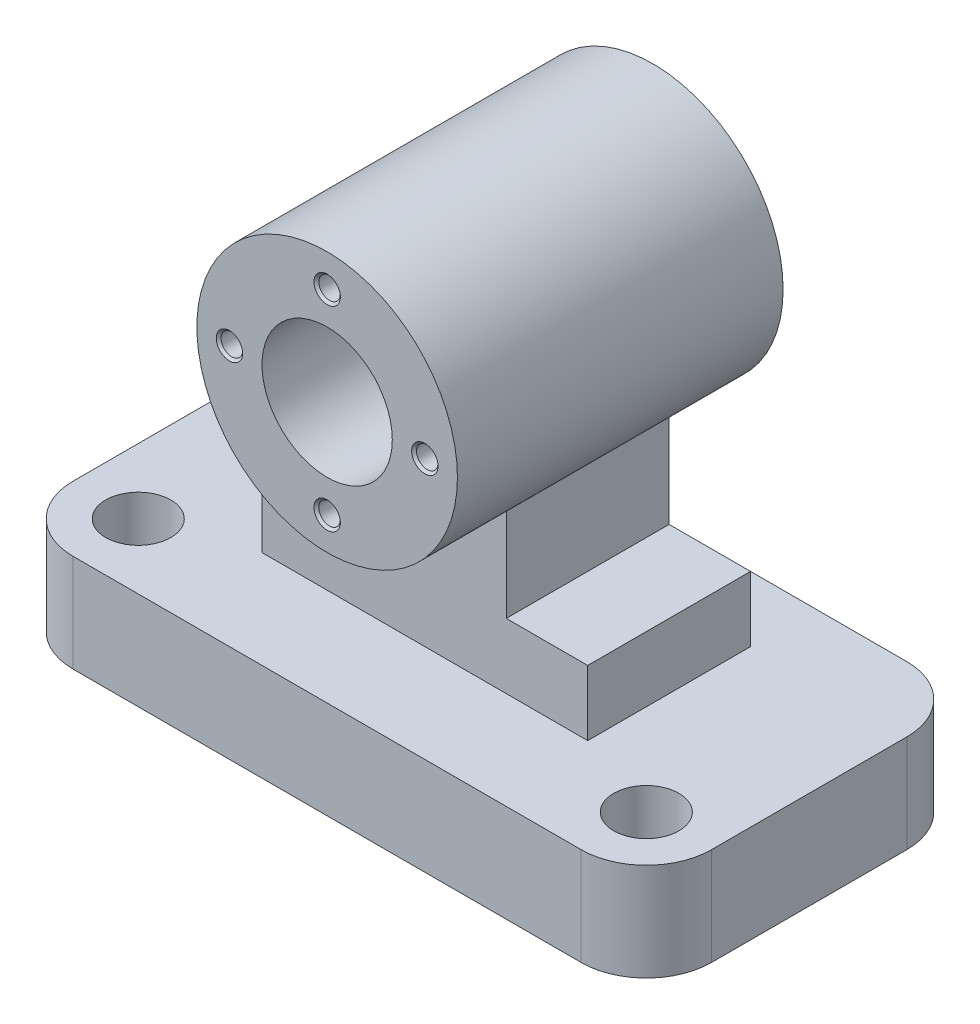
ISO-10303-21;
HEADER;
FILE_DESCRIPTION(('STEP AP214'),'2;1');
FILE_NAME('part.step','',(''),(''),'','','');
FILE_SCHEMA(('AUTOMOTIVE_DESIGN { 1 0 10303 214 1 1 1 1 }'));
ENDSEC;
DATA;
#1=APPLICATION_CONTEXT('core data for automotive mechanical design processes');
#2=APPLICATION_PROTOCOL_DEFINITION('international standard','automotive_design',2000,#1);
#3=PRODUCT_CONTEXT('',#1,'mechanical');
#4=PRODUCT('Part','Part','',(#3));
#5=PRODUCT_RELATED_PRODUCT_CATEGORY('part','',(#4));
#6=PRODUCT_DEFINITION_FORMATION('','',#4);
#7=PRODUCT_DEFINITION_CONTEXT('part definition',#1,'design');
#8=PRODUCT_DEFINITION('design','',#6,#7);
#9=PRODUCT_DEFINITION_SHAPE('','',#8);
#10=(LENGTH_UNIT() NAMED_UNIT(*) SI_UNIT(.MILLI.,.METRE.));
#11=(NAMED_UNIT(*) PLANE_ANGLE_UNIT() SI_UNIT($,.RADIAN.));
#12=(NAMED_UNIT(*) SI_UNIT($,.STERADIAN.) SOLID_ANGLE_UNIT());
#13=UNCERTAINTY_MEASURE_WITH_UNIT(LENGTH_MEASURE(1.E-05),#10,'distance_accuracy_value','');
#14=(GEOMETRIC_REPRESENTATION_CONTEXT(3) GLOBAL_UNCERTAINTY_ASSIGNED_CONTEXT((#13)) GLOBAL_UNIT_ASSIGNED_CONTEXT((#10,
#11,#12)) REPRESENTATION_CONTEXT('',''));
#15=CARTESIAN_POINT('',(0.,0.,0.));
#16=DIRECTION('',(0.,0.,1.));
#17=DIRECTION('',(1.,0.,0.));
#18=AXIS2_PLACEMENT_3D('',#15,#16,#17);
#19=CARTESIAN_POINT('',(-49.,-20.0073969276246,50.));
#20=DIRECTION('',(0.,-1.,0.));
#21=DIRECTION('',(0.,0.,-1.));
#22=AXIS2_PLACEMENT_3D('',#19,#20,#21);
#23=PLANE('',#22);
#24=CARTESIAN_POINT('',(-39.,-20.0073969276246,40.));
#25=DIRECTION('',(0.,1.,0.));
#26=DIRECTION('',(0.,0.,1.));
#27=AXIS2_PLACEMENT_3D('',#24,#25,#26);
#28=CIRCLE('',#27,5.);
#29=CARTESIAN_POINT('',(-39.,-20.0073969276246,45.));
#30=VERTEX_POINT('',#29);
#31=EDGE_CURVE('E246',#30,#30,#28,.T.);
#32=ORIENTED_EDGE('',*,*,#31,.F.);
#33=EDGE_LOOP('',(#32));
#34=FACE_BOUND('',#33,.T.);
#35=CARTESIAN_POINT('',(39.,-20.0073969276246,40.));
#36=DIRECTION('',(0.,1.,0.));
#37=DIRECTION('',(0.,0.,1.));
#38=AXIS2_PLACEMENT_3D('',#35,#36,#37);
#39=CIRCLE('',#38,5.);
#40=CARTESIAN_POINT('',(39.,-20.0073969276246,45.));
#41=VERTEX_POINT('',#40);
#42=EDGE_CURVE('E245',#41,#41,#39,.T.);
#43=ORIENTED_EDGE('',*,*,#42,.F.);
#44=EDGE_LOOP('',(#43));
#45=FACE_BOUND('',#44,.T.);
#46=DIRECTION('',(-1.,0.,0.));
#47=VECTOR('',#46,1.);
#48=CARTESIAN_POINT('',(-49.,-20.0073969276246,0.));
#49=LINE('',#48,#47);
#50=CARTESIAN_POINT('',(39.,-20.0073969276246,0.));
#51=VERTEX_POINT('',#50);
#52=CARTESIAN_POINT('',(-39.,-20.0073969276246,0.));
#53=VERTEX_POINT('',#52);
#54=EDGE_CURVE('E287',#51,#53,#49,.T.);
#55=ORIENTED_EDGE('',*,*,#54,.T.);
#56=CARTESIAN_POINT('',(-39.,-20.0073969276246,10.));
#57=DIRECTION('',(0.,-1.,0.));
#58=DIRECTION('',(0.,0.,-1.));
#59=AXIS2_PLACEMENT_3D('',#56,#57,#58);
#60=CIRCLE('',#59,10.);
#61=CARTESIAN_POINT('',(-49.,-20.0073969276246,10.));
#62=VERTEX_POINT('',#61);
#63=EDGE_CURVE('E348',#53,#62,#60,.F.);
#64=ORIENTED_EDGE('',*,*,#63,.T.);
#65=DIRECTION('',(0.,0.,-1.));
#66=VECTOR('',#65,1.);
#67=CARTESIAN_POINT('',(-49.,-20.0073969276246,50.));
#68=LINE('',#67,#66);
#69=CARTESIAN_POINT('',(-49.,-20.0073969276246,40.));
#70=VERTEX_POINT('',#69);
#71=EDGE_CURVE('E313',#70,#62,#68,.T.);
#72=ORIENTED_EDGE('',*,*,#71,.F.);
#73=CARTESIAN_POINT('',(-39.,-20.0073969276246,40.));
#74=DIRECTION('',(0.,-1.,0.));
#75=DIRECTION('',(0.,0.,-1.));
#76=AXIS2_PLACEMENT_3D('',#73,#74,#75);
#77=CIRCLE('',#76,10.);
#78=CARTESIAN_POINT('',(-39.,-20.0073969276246,50.));
#79=VERTEX_POINT('',#78);
#80=EDGE_CURVE('E342',#70,#79,#77,.F.);
#81=ORIENTED_EDGE('',*,*,#80,.T.);
#82=DIRECTION('',(-1.,0.,0.));
#83=VECTOR('',#82,1.);
#84=CARTESIAN_POINT('',(-49.,-20.0073969276246,50.));
#85=LINE('',#84,#83);
#86=CARTESIAN_POINT('',(39.,-20.0073969276246,50.));
#87=VERTEX_POINT('',#86);
#88=EDGE_CURVE('E296',#87,#79,#85,.T.);
#89=ORIENTED_EDGE('',*,*,#88,.F.);
#90=CARTESIAN_POINT('',(39.,-20.0073969276246,40.));
#91=DIRECTION('',(0.,-1.,0.));
#92=DIRECTION('',(0.,0.,-1.));
#93=AXIS2_PLACEMENT_3D('',#90,#91,#92);
#94=CIRCLE('',#93,10.);
#95=CARTESIAN_POINT('',(49.,-20.0073969276246,40.));
#96=VERTEX_POINT('',#95);
#97=EDGE_CURVE('E344',#87,#96,#94,.F.);
#98=ORIENTED_EDGE('',*,*,#97,.T.);
#99=DIRECTION('',(0.,0.,-1.));
#100=VECTOR('',#99,1.);
#101=CARTESIAN_POINT('',(49.,-20.0073969276246,50.));
#102=LINE('',#101,#100);
#103=CARTESIAN_POINT('',(49.,-20.0073969276246,10.));
#104=VERTEX_POINT('',#103);
#105=EDGE_CURVE('E316',#96,#104,#102,.T.);
#106=ORIENTED_EDGE('',*,*,#105,.T.);
#107=CARTESIAN_POINT('',(39.,-20.0073969276246,10.));
#108=DIRECTION('',(0.,-1.,0.));
#109=DIRECTION('',(0.,0.,-1.));
#110=AXIS2_PLACEMENT_3D('',#107,#108,#109);
#111=CIRCLE('',#110,10.);
#112=EDGE_CURVE('E346',#104,#51,#111,.F.);
#113=ORIENTED_EDGE('',*,*,#112,.T.);
#114=EDGE_LOOP('',(#55,#64,#72,#81,#89,#98,#106,#113));
#115=FACE_BOUND('',#114,.T.);
#116=DIRECTION('',(1.,0.,0.));
#117=VECTOR('',#116,1.);
#118=CARTESIAN_POINT('',(-12.5,-20.0073969276246,10.));
#119=LINE('',#118,#117);
#120=CARTESIAN_POINT('',(-25.,-20.0073969276246,9.99999999999999));
#121=VERTEX_POINT('',#120);
#122=CARTESIAN_POINT('',(25.,-20.0073969276246,9.99999999999999));
#123=VERTEX_POINT('',#122);
#124=EDGE_CURVE('E56',#121,#123,#119,.T.);
#125=ORIENTED_EDGE('',*,*,#124,.T.);
#126=DIRECTION('',(0.,0.,1.));
#127=VECTOR('',#126,1.);
#128=CARTESIAN_POINT('',(25.,-20.0073969276246,9.99999999999999));
#129=LINE('',#128,#127);
#130=CARTESIAN_POINT('',(25.,-20.0073969276246,35.));
#131=VERTEX_POINT('',#130);
#132=EDGE_CURVE('E189',#123,#131,#129,.T.);
#133=ORIENTED_EDGE('',*,*,#132,.T.);
#134=DIRECTION('',(1.,0.,0.));
#135=VECTOR('',#134,1.);
#136=CARTESIAN_POINT('',(-12.5,-20.0073969276246,35.));
#137=LINE('',#136,#135);
#138=CARTESIAN_POINT('',(-25.,-20.0073969276246,35.));
#139=VERTEX_POINT('',#138);
#140=EDGE_CURVE('E64',#139,#131,#137,.T.);
#141=ORIENTED_EDGE('',*,*,#140,.F.);
#142=DIRECTION('',(0.,0.,1.));
#143=VECTOR('',#142,1.);
#144=CARTESIAN_POINT('',(-25.,-20.0073969276246,9.99999999999999));
#145=LINE('',#144,#143);
#146=EDGE_CURVE('E202',#121,#139,#145,.T.);
#147=ORIENTED_EDGE('',*,*,#146,.F.);
#148=EDGE_LOOP('',(#125,#133,#141,#147));
#149=FACE_BOUND('',#148,.T.);
#150=ADVANCED_FACE('F41',(#34,#45,#115,#149),#23,.F.);
#151=CARTESIAN_POINT('',(-12.5,4.33819887216126,35.));
#152=DIRECTION('',(0.,1.,0.));
#153=DIRECTION('',(0.,0.,1.));
#154=AXIS2_PLACEMENT_3D('',#151,#152,#153);
#155=PLANE('',#154);
#156=DIRECTION('',(0.,0.,1.));
#157=VECTOR('',#156,1.);
#158=CARTESIAN_POINT('',(-12.4474748096278,4.33819887216126,0.));
#159=LINE('',#158,#157);
#160=CARTESIAN_POINT('',(-12.4474748096278,4.33819887216126,10.));
#161=VERTEX_POINT('',#160);
#162=CARTESIAN_POINT('',(-12.4474748096278,4.33819887216126,35.));
#163=VERTEX_POINT('',#162);
#164=EDGE_CURVE('E322',#161,#163,#159,.T.);
#165=ORIENTED_EDGE('',*,*,#164,.F.);
#166=DIRECTION('',(1.,0.,0.));
#167=VECTOR('',#166,1.);
#168=CARTESIAN_POINT('',(-12.5,4.33819887216126,10.));
#169=LINE('',#168,#167);
#170=CARTESIAN_POINT('',(-12.5,4.33819887216126,10.));
#171=VERTEX_POINT('',#170);
#172=EDGE_CURVE('E293',#171,#161,#169,.T.);
#173=ORIENTED_EDGE('',*,*,#172,.F.);
#174=DIRECTION('',(0.,0.,1.));
#175=VECTOR('',#174,1.);
#176=CARTESIAN_POINT('',(-12.5,4.33819887216126,35.));
#177=LINE('',#176,#175);
#178=CARTESIAN_POINT('',(-12.5,4.33819887216126,35.));
#179=VERTEX_POINT('',#178);
#180=EDGE_CURVE('E273',#171,#179,#177,.T.);
#181=ORIENTED_EDGE('',*,*,#180,.T.);
#182=DIRECTION('',(1.,0.,0.));
#183=VECTOR('',#182,1.);
#184=CARTESIAN_POINT('',(-12.5,4.33819887216126,35.));
#185=LINE('',#184,#183);
#186=EDGE_CURVE('E289',#179,#163,#185,.T.);
#187=ORIENTED_EDGE('',*,*,#186,.T.);
#188=EDGE_LOOP('',(#165,#173,#181,#187));
#189=FACE_BOUND('',#188,.T.);
#190=ADVANCED_FACE('F383',(#189),#155,.T.);
#191=CARTESIAN_POINT('',(49.,-20.0073969276246,50.));
#192=DIRECTION('',(-1.,0.,0.));
#193=DIRECTION('',(0.,-1.,0.));
#194=AXIS2_PLACEMENT_3D('',#191,#192,#193);
#195=PLANE('',#194);
#196=DIRECTION('',(0.,0.,-1.));
#197=VECTOR('',#196,1.);
#198=CARTESIAN_POINT('',(49.,-35.0073969276246,50.));
#199=LINE('',#198,#197);
#200=CARTESIAN_POINT('',(49.,-35.0073969276246,40.));
#201=VERTEX_POINT('',#200);
#202=CARTESIAN_POINT('',(49.,-35.0073969276246,10.));
#203=VERTEX_POINT('',#202);
#204=EDGE_CURVE('E303',#201,#203,#199,.T.);
#205=ORIENTED_EDGE('',*,*,#204,.T.);
#206=DIRECTION('',(0.,1.,0.));
#207=VECTOR('',#206,1.);
#208=CARTESIAN_POINT('',(49.,-20.0073969276246,10.));
#209=LINE('',#208,#207);
#210=EDGE_CURVE('E352',#203,#104,#209,.T.);
#211=ORIENTED_EDGE('',*,*,#210,.T.);
#212=ORIENTED_EDGE('',*,*,#105,.F.);
#213=DIRECTION('',(0.,1.,0.));
#214=VECTOR('',#213,1.);
#215=CARTESIAN_POINT('',(49.,-35.0073969276246,40.));
#216=LINE('',#215,#214);
#217=EDGE_CURVE('E350',#96,#201,#216,.F.);
#218=ORIENTED_EDGE('',*,*,#217,.T.);
#219=EDGE_LOOP('',(#205,#211,#212,#218));
#220=FACE_BOUND('',#219,.T.);
#221=ADVANCED_FACE('F389',(#220),#195,.F.);
#222=CARTESIAN_POINT('',(-49.,-20.0073969276246,50.));
#223=DIRECTION('',(1.,0.,0.));
#224=DIRECTION('',(0.,0.,-1.));
#225=AXIS2_PLACEMENT_3D('',#222,#223,#224);
#226=PLANE('',#225);
#227=ORIENTED_EDGE('',*,*,#71,.T.);
#228=DIRECTION('',(0.,-1.,0.));
#229=VECTOR('',#228,1.);
#230=CARTESIAN_POINT('',(-49.,-20.0073969276246,10.));
#231=LINE('',#230,#229);
#232=CARTESIAN_POINT('',(-49.,-35.0073969276246,10.));
#233=VERTEX_POINT('',#232);
#234=EDGE_CURVE('E327',#62,#233,#231,.T.);
#235=ORIENTED_EDGE('',*,*,#234,.T.);
#236=DIRECTION('',(0.,0.,-1.));
#237=VECTOR('',#236,1.);
#238=CARTESIAN_POINT('',(-49.,-35.0073969276246,50.));
#239=LINE('',#238,#237);
#240=CARTESIAN_POINT('',(-49.,-35.0073969276246,40.));
#241=VERTEX_POINT('',#240);
#242=EDGE_CURVE('E310',#241,#233,#239,.T.);
#243=ORIENTED_EDGE('',*,*,#242,.F.);
#244=DIRECTION('',(0.,-1.,0.));
#245=VECTOR('',#244,1.);
#246=CARTESIAN_POINT('',(-49.,-20.0073969276246,40.));
#247=LINE('',#246,#245);
#248=EDGE_CURVE('E325',#241,#70,#247,.F.);
#249=ORIENTED_EDGE('',*,*,#248,.T.);
#250=EDGE_LOOP('',(#227,#235,#243,#249));
#251=FACE_BOUND('',#250,.T.);
#252=ADVANCED_FACE('F397',(#251),#226,.F.);
#253=CARTESIAN_POINT('',(-49.,-35.0073969276246,50.));
#254=DIRECTION('',(0.,1.,0.));
#255=DIRECTION('',(0.,0.,1.));
#256=AXIS2_PLACEMENT_3D('',#253,#254,#255);
#257=PLANE('',#256);
#258=CARTESIAN_POINT('',(-39.,-35.0073969276246,40.));
#259=DIRECTION('',(0.,1.,0.));
#260=DIRECTION('',(0.,0.,1.));
#261=AXIS2_PLACEMENT_3D('',#258,#259,#260);
#262=CIRCLE('',#261,5.);
#263=CARTESIAN_POINT('',(-39.,-35.0073969276246,45.));
#264=VERTEX_POINT('',#263);
#265=EDGE_CURVE('E259',#264,#264,#262,.T.);
#266=ORIENTED_EDGE('',*,*,#265,.T.);
#267=EDGE_LOOP('',(#266));
#268=FACE_BOUND('',#267,.T.);
#269=CARTESIAN_POINT('',(39.,-35.0073969276246,40.));
#270=DIRECTION('',(0.,1.,0.));
#271=DIRECTION('',(0.,0.,1.));
#272=AXIS2_PLACEMENT_3D('',#269,#270,#271);
#273=CIRCLE('',#272,5.);
#274=CARTESIAN_POINT('',(39.,-35.0073969276246,45.));
#275=VERTEX_POINT('',#274);
#276=EDGE_CURVE('E249',#275,#275,#273,.T.);
#277=ORIENTED_EDGE('',*,*,#276,.T.);
#278=EDGE_LOOP('',(#277));
#279=FACE_BOUND('',#278,.T.);
#280=ORIENTED_EDGE('',*,*,#242,.T.);
#281=CARTESIAN_POINT('',(-39.,-35.0073969276246,10.));
#282=DIRECTION('',(0.,1.,0.));
#283=DIRECTION('',(0.,0.,1.));
#284=AXIS2_PLACEMENT_3D('',#281,#282,#283);
#285=CIRCLE('',#284,10.);
#286=CARTESIAN_POINT('',(-39.,-35.0073969276246,0.));
#287=VERTEX_POINT('',#286);
#288=EDGE_CURVE('E336',#233,#287,#285,.F.);
#289=ORIENTED_EDGE('',*,*,#288,.T.);
#290=DIRECTION('',(1.,0.,0.));
#291=VECTOR('',#290,1.);
#292=CARTESIAN_POINT('',(-49.,-35.0073969276246,0.));
#293=LINE('',#292,#291);
#294=CARTESIAN_POINT('',(39.,-35.0073969276246,0.));
#295=VERTEX_POINT('',#294);
#296=EDGE_CURVE('E300',#287,#295,#293,.T.);
#297=ORIENTED_EDGE('',*,*,#296,.T.);
#298=CARTESIAN_POINT('',(39.,-35.0073969276246,10.));
#299=DIRECTION('',(0.,1.,0.));
#300=DIRECTION('',(0.,0.,1.));
#301=AXIS2_PLACEMENT_3D('',#298,#299,#300);
#302=CIRCLE('',#301,10.);
#303=EDGE_CURVE('E334',#295,#203,#302,.F.);
#304=ORIENTED_EDGE('',*,*,#303,.T.);
#305=ORIENTED_EDGE('',*,*,#204,.F.);
#306=CARTESIAN_POINT('',(39.,-35.0073969276246,40.));
#307=DIRECTION('',(0.,1.,0.));
#308=DIRECTION('',(0.,0.,1.));
#309=AXIS2_PLACEMENT_3D('',#306,#307,#308);
#310=CIRCLE('',#309,10.);
#311=CARTESIAN_POINT('',(39.,-35.0073969276246,50.));
#312=VERTEX_POINT('',#311);
#313=EDGE_CURVE('E332',#201,#312,#310,.F.);
#314=ORIENTED_EDGE('',*,*,#313,.T.);
#315=DIRECTION('',(1.,0.,0.));
#316=VECTOR('',#315,1.);
#317=CARTESIAN_POINT('',(-49.,-35.0073969276246,50.));
#318=LINE('',#317,#316);
#319=CARTESIAN_POINT('',(-39.,-35.0073969276246,50.));
#320=VERTEX_POINT('',#319);
#321=EDGE_CURVE('E299',#320,#312,#318,.T.);
#322=ORIENTED_EDGE('',*,*,#321,.F.);
#323=CARTESIAN_POINT('',(-39.,-35.0073969276246,40.));
#324=DIRECTION('',(0.,1.,0.));
#325=DIRECTION('',(0.,0.,1.));
#326=AXIS2_PLACEMENT_3D('',#323,#324,#325);
#327=CIRCLE('',#326,10.);
#328=EDGE_CURVE('E330',#320,#241,#327,.F.);
#329=ORIENTED_EDGE('',*,*,#328,.T.);
#330=EDGE_LOOP('',(#280,#289,#297,#304,#305,#314,#322,#329));
#331=FACE_BOUND('',#330,.T.);
#332=ADVANCED_FACE('F364',(#268,#279,#331),#257,.F.);
#333=CARTESIAN_POINT('',(0.,0.,50.));
#334=DIRECTION('',(0.,0.,1.));
#335=DIRECTION('',(1.,0.,0.));
#336=AXIS2_PLACEMENT_3D('',#333,#334,#335);
#337=PLANE('',#336);
#338=ORIENTED_EDGE('',*,*,#321,.T.);
#339=DIRECTION('',(0.,1.,0.));
#340=VECTOR('',#339,1.);
#341=CARTESIAN_POINT('',(39.,-20.0073969276246,50.));
#342=LINE('',#341,#340);
#343=EDGE_CURVE('E49',#312,#87,#342,.T.);
#344=ORIENTED_EDGE('',*,*,#343,.T.);
#345=ORIENTED_EDGE('',*,*,#88,.T.);
#346=DIRECTION('',(0.,-1.,0.));
#347=VECTOR('',#346,1.);
#348=CARTESIAN_POINT('',(-39.,-35.0073969276246,50.));
#349=LINE('',#348,#347);
#350=EDGE_CURVE('E355',#79,#320,#349,.T.);
#351=ORIENTED_EDGE('',*,*,#350,.T.);
#352=EDGE_LOOP('',(#338,#344,#345,#351));
#353=FACE_BOUND('',#352,.T.);
#354=ADVANCED_FACE('F424',(#353),#337,.T.);
#355=CARTESIAN_POINT('',(0.,0.,0.));
#356=DIRECTION('',(0.,0.,1.));
#357=DIRECTION('',(1.,0.,0.));
#358=AXIS2_PLACEMENT_3D('',#355,#356,#357);
#359=PLANE('',#358);
#360=ORIENTED_EDGE('',*,*,#296,.F.);
#361=DIRECTION('',(0.,-1.,0.));
#362=VECTOR('',#361,1.);
#363=CARTESIAN_POINT('',(-39.,0.,0.));
#364=LINE('',#363,#362);
#365=EDGE_CURVE('E340',#287,#53,#364,.F.);
#366=ORIENTED_EDGE('',*,*,#365,.T.);
#367=ORIENTED_EDGE('',*,*,#54,.F.);
#368=DIRECTION('',(0.,1.,0.));
#369=VECTOR('',#368,1.);
#370=CARTESIAN_POINT('',(39.,0.,0.));
#371=LINE('',#370,#369);
#372=EDGE_CURVE('E338',#51,#295,#371,.F.);
#373=ORIENTED_EDGE('',*,*,#372,.T.);
#374=EDGE_LOOP('',(#360,#366,#367,#373));
#375=FACE_BOUND('',#374,.T.);
#376=ADVANCED_FACE('F438',(#375),#359,.F.);
#377=CARTESIAN_POINT('',(-12.5,4.33819887216126,10.));
#378=DIRECTION('',(0.,0.,-1.));
#379=DIRECTION('',(0.,1.,0.));
#380=AXIS2_PLACEMENT_3D('',#377,#378,#379);
#381=PLANE('',#380);
#382=DIRECTION('',(0.,1.,0.));
#383=VECTOR('',#382,1.);
#384=CARTESIAN_POINT('',(12.5,4.33819887216126,10.));
#385=LINE('',#384,#383);
#386=CARTESIAN_POINT('',(12.5,-10.0073969276246,10.));
#387=VERTEX_POINT('',#386);
#388=CARTESIAN_POINT('',(12.5,4.33819887216126,10.));
#389=VERTEX_POINT('',#388);
#390=EDGE_CURVE('E185',#387,#389,#385,.T.);
#391=ORIENTED_EDGE('',*,*,#390,.F.);
#392=DIRECTION('',(-1.,0.,0.));
#393=VECTOR('',#392,1.);
#394=CARTESIAN_POINT('',(-25.,-10.0073969276246,9.99999999999999));
#395=LINE('',#394,#393);
#396=CARTESIAN_POINT('',(25.,-10.0073969276246,9.99999999999999));
#397=VERTEX_POINT('',#396);
#398=EDGE_CURVE('E170',#397,#387,#395,.T.);
#399=ORIENTED_EDGE('',*,*,#398,.F.);
#400=DIRECTION('',(0.,1.,0.));
#401=VECTOR('',#400,1.);
#402=CARTESIAN_POINT('',(25.,-10.0073969276246,9.99999999999999));
#403=LINE('',#402,#401);
#404=EDGE_CURVE('E183',#123,#397,#403,.T.);
#405=ORIENTED_EDGE('',*,*,#404,.F.);
#406=ORIENTED_EDGE('',*,*,#124,.F.);
#407=DIRECTION('',(0.,-1.,0.));
#408=VECTOR('',#407,1.);
#409=CARTESIAN_POINT('',(-25.,-10.0073969276246,9.99999999999999));
#410=LINE('',#409,#408);
#411=CARTESIAN_POINT('',(-25.,-10.0073969276246,9.99999999999999));
#412=VERTEX_POINT('',#411);
#413=EDGE_CURVE('E177',#412,#121,#410,.T.);
#414=ORIENTED_EDGE('',*,*,#413,.F.);
#415=CARTESIAN_POINT('',(-12.5,-10.0073969276246,9.99999999999999));
#416=VERTEX_POINT('',#415);
#417=EDGE_CURVE('E186',#416,#412,#395,.T.);
#418=ORIENTED_EDGE('',*,*,#417,.F.);
#419=DIRECTION('',(0.,1.,0.));
#420=VECTOR('',#419,1.);
#421=CARTESIAN_POINT('',(-12.5,4.33819887216126,10.));
#422=LINE('',#421,#420);
#423=EDGE_CURVE('E271',#416,#171,#422,.T.);
#424=ORIENTED_EDGE('',*,*,#423,.T.);
#425=ORIENTED_EDGE('',*,*,#172,.T.);
#426=CARTESIAN_POINT('',(0.,19.9926030723754,10.));
#427=DIRECTION('',(0.,0.,-1.));
#428=DIRECTION('',(0.,1.,0.));
#429=AXIS2_PLACEMENT_3D('',#426,#427,#428);
#430=CIRCLE('',#429,20.);
#431=CARTESIAN_POINT('',(12.4474748096278,4.33819887216126,10.));
#432=VERTEX_POINT('',#431);
#433=EDGE_CURVE('E268',#432,#161,#430,.T.);
#434=ORIENTED_EDGE('',*,*,#433,.F.);
#435=EDGE_CURVE('E280',#432,#389,#169,.T.);
#436=ORIENTED_EDGE('',*,*,#435,.T.);
#437=EDGE_LOOP('',(#391,#399,#405,#406,#414,#418,#424,#425,#434,#436));
#438=FACE_BOUND('',#437,.T.);
#439=ADVANCED_FACE('F182',(#438),#381,.T.);
#440=CARTESIAN_POINT('',(-12.5,4.33819887216126,35.));
#441=DIRECTION('',(0.,0.,1.));
#442=DIRECTION('',(1.,0.,0.));
#443=AXIS2_PLACEMENT_3D('',#440,#441,#442);
#444=PLANE('',#443);
#445=DIRECTION('',(0.,-1.,0.));
#446=VECTOR('',#445,1.);
#447=CARTESIAN_POINT('',(-12.5,4.33819887216126,35.));
#448=LINE('',#447,#446);
#449=CARTESIAN_POINT('',(-12.5,-10.0073969276246,35.));
#450=VERTEX_POINT('',#449);
#451=EDGE_CURVE('E277',#179,#450,#448,.T.);
#452=ORIENTED_EDGE('',*,*,#451,.T.);
#453=DIRECTION('',(-1.,0.,0.));
#454=VECTOR('',#453,1.);
#455=CARTESIAN_POINT('',(-25.,-10.0073969276246,35.));
#456=LINE('',#455,#454);
#457=CARTESIAN_POINT('',(-25.,-10.0073969276246,35.));
#458=VERTEX_POINT('',#457);
#459=EDGE_CURVE('E198',#450,#458,#456,.T.);
#460=ORIENTED_EDGE('',*,*,#459,.T.);
#461=DIRECTION('',(0.,-1.,0.));
#462=VECTOR('',#461,1.);
#463=CARTESIAN_POINT('',(-25.,-10.0073969276246,35.));
#464=LINE('',#463,#462);
#465=EDGE_CURVE('E190',#458,#139,#464,.T.);
#466=ORIENTED_EDGE('',*,*,#465,.T.);
#467=ORIENTED_EDGE('',*,*,#140,.T.);
#468=DIRECTION('',(0.,1.,0.));
#469=VECTOR('',#468,1.);
#470=CARTESIAN_POINT('',(25.,-10.0073969276246,35.));
#471=LINE('',#470,#469);
#472=CARTESIAN_POINT('',(25.,-10.0073969276246,35.));
#473=VERTEX_POINT('',#472);
#474=EDGE_CURVE('E196',#131,#473,#471,.T.);
#475=ORIENTED_EDGE('',*,*,#474,.T.);
#476=CARTESIAN_POINT('',(12.5,-10.0073969276246,35.));
#477=VERTEX_POINT('',#476);
#478=EDGE_CURVE('E172',#473,#477,#456,.T.);
#479=ORIENTED_EDGE('',*,*,#478,.T.);
#480=DIRECTION('',(0.,-1.,0.));
#481=VECTOR('',#480,1.);
#482=CARTESIAN_POINT('',(12.5,4.33819887216126,35.));
#483=LINE('',#482,#481);
#484=CARTESIAN_POINT('',(12.5,4.33819887216126,35.));
#485=VERTEX_POINT('',#484);
#486=EDGE_CURVE('E274',#485,#477,#483,.T.);
#487=ORIENTED_EDGE('',*,*,#486,.F.);
#488=CARTESIAN_POINT('',(12.4474748096278,4.33819887216126,35.));
#489=VERTEX_POINT('',#488);
#490=EDGE_CURVE('E292',#489,#485,#185,.T.);
#491=ORIENTED_EDGE('',*,*,#490,.F.);
#492=CARTESIAN_POINT('',(0.,19.9926030723754,35.));
#493=DIRECTION('',(0.,0.,1.));
#494=DIRECTION('',(1.,0.,0.));
#495=AXIS2_PLACEMENT_3D('',#492,#493,#494);
#496=CIRCLE('',#495,20.);
#497=EDGE_CURVE('E263',#163,#489,#496,.T.);
#498=ORIENTED_EDGE('',*,*,#497,.F.);
#499=ORIENTED_EDGE('',*,*,#186,.F.);
#500=EDGE_LOOP('',(#452,#460,#466,#467,#475,#479,#487,#491,#498,#499));
#501=FACE_BOUND('',#500,.T.);
#502=ADVANCED_FACE('F450',(#501),#444,.T.);
#503=DIRECTION('',(0.,0.,1.));
#504=VECTOR('',#503,1.);
#505=CARTESIAN_POINT('',(12.4474748096278,4.33819887216126,0.));
#506=LINE('',#505,#504);
#507=EDGE_CURVE('E319',#489,#432,#506,.F.);
#508=ORIENTED_EDGE('',*,*,#507,.F.);
#509=ORIENTED_EDGE('',*,*,#490,.T.);
#510=DIRECTION('',(0.,0.,1.));
#511=VECTOR('',#510,1.);
#512=CARTESIAN_POINT('',(12.5,4.33819887216126,35.));
#513=LINE('',#512,#511);
#514=EDGE_CURVE('E282',#389,#485,#513,.T.);
#515=ORIENTED_EDGE('',*,*,#514,.F.);
#516=ORIENTED_EDGE('',*,*,#435,.F.);
#517=EDGE_LOOP('',(#508,#509,#515,#516));
#518=FACE_BOUND('',#517,.T.);
#519=ADVANCED_FACE('F392',(#518),#155,.T.);
#520=CARTESIAN_POINT('',(-12.5,0.,0.));
#521=DIRECTION('',(1.,0.,0.));
#522=DIRECTION('',(0.,0.,-1.));
#523=AXIS2_PLACEMENT_3D('',#520,#521,#522);
#524=PLANE('',#523);
#525=ORIENTED_EDGE('',*,*,#423,.F.);
#526=DIRECTION('',(0.,0.,1.));
#527=VECTOR('',#526,1.);
#528=CARTESIAN_POINT('',(-12.5,-10.0073969276246,0.));
#529=LINE('',#528,#527);
#530=EDGE_CURVE('E201',#416,#450,#529,.T.);
#531=ORIENTED_EDGE('',*,*,#530,.T.);
#532=ORIENTED_EDGE('',*,*,#451,.F.);
#533=ORIENTED_EDGE('',*,*,#180,.F.);
#534=EDGE_LOOP('',(#525,#531,#532,#533));
#535=FACE_BOUND('',#534,.T.);
#536=ADVANCED_FACE('F480',(#535),#524,.F.);
#537=CARTESIAN_POINT('',(12.5,0.,0.));
#538=DIRECTION('',(1.,0.,0.));
#539=DIRECTION('',(0.,0.,-1.));
#540=AXIS2_PLACEMENT_3D('',#537,#538,#539);
#541=PLANE('',#540);
#542=DIRECTION('',(0.,0.,1.));
#543=VECTOR('',#542,1.);
#544=CARTESIAN_POINT('',(12.5,-10.0073969276246,0.));
#545=LINE('',#544,#543);
#546=EDGE_CURVE('E11',#387,#477,#545,.T.);
#547=ORIENTED_EDGE('',*,*,#546,.F.);
#548=ORIENTED_EDGE('',*,*,#390,.T.);
#549=ORIENTED_EDGE('',*,*,#514,.T.);
#550=ORIENTED_EDGE('',*,*,#486,.T.);
#551=EDGE_LOOP('',(#547,#548,#549,#550));
#552=FACE_BOUND('',#551,.T.);
#553=ADVANCED_FACE('F494',(#552),#541,.T.);
#554=CARTESIAN_POINT('',(0.,19.9926030723754,0.));
#555=DIRECTION('',(0.,0.,1.));
#556=DIRECTION('',(1.,0.,0.));
#557=AXIS2_PLACEMENT_3D('',#554,#555,#556);
#558=CYLINDRICAL_SURFACE('',#557,20.);
#559=ORIENTED_EDGE('',*,*,#433,.T.);
#560=ORIENTED_EDGE('',*,*,#164,.T.);
#561=ORIENTED_EDGE('',*,*,#497,.T.);
#562=ORIENTED_EDGE('',*,*,#507,.T.);
#563=EDGE_LOOP('',(#559,#560,#561,#562));
#564=FACE_BOUND('',#563,.T.);
#565=CARTESIAN_POINT('',(0.,19.9926030723754,0.));
#566=DIRECTION('',(0.,0.,1.));
#567=DIRECTION('',(1.,0.,0.));
#568=AXIS2_PLACEMENT_3D('',#565,#566,#567);
#569=CIRCLE('',#568,20.);
#570=CARTESIAN_POINT('',(20.,19.9926030723754,0.));
#571=VERTEX_POINT('',#570);
#572=EDGE_CURVE('E260',#571,#571,#569,.T.);
#573=ORIENTED_EDGE('',*,*,#572,.T.);
#574=EDGE_LOOP('',(#573));
#575=FACE_BOUND('',#574,.T.);
#576=CARTESIAN_POINT('',(0.,19.9926030723754,50.));
#577=DIRECTION('',(0.,0.,1.));
#578=DIRECTION('',(1.,0.,0.));
#579=AXIS2_PLACEMENT_3D('',#576,#577,#578);
#580=CIRCLE('',#579,20.);
#581=CARTESIAN_POINT('',(20.,19.9926030723754,50.));
#582=VERTEX_POINT('',#581);
#583=EDGE_CURVE('E255',#582,#582,#580,.T.);
#584=ORIENTED_EDGE('',*,*,#583,.F.);
#585=EDGE_LOOP('',(#584));
#586=FACE_BOUND('',#585,.T.);
#587=ADVANCED_FACE('F489',(#564,#575,#586),#558,.T.);
#588=CARTESIAN_POINT('',(0.,19.9926030723754,0.));
#589=DIRECTION('',(0.,0.,1.));
#590=DIRECTION('',(1.,0.,0.));
#591=AXIS2_PLACEMENT_3D('',#588,#589,#590);
#592=PLANE('',#591);
#593=CARTESIAN_POINT('',(0.,34.9926030723754,0.));
#594=DIRECTION('',(0.,0.,1.));
#595=DIRECTION('',(1.,0.,0.));
#596=AXIS2_PLACEMENT_3D('',#593,#594,#595);
#597=CIRCLE('',#596,1.65);
#598=CARTESIAN_POINT('',(1.65,34.9926030723754,0.));
#599=VERTEX_POINT('',#598);
#600=EDGE_CURVE('E215',#599,#599,#597,.T.);
#601=ORIENTED_EDGE('',*,*,#600,.T.);
#602=EDGE_LOOP('',(#601));
#603=FACE_BOUND('',#602,.T.);
#604=CARTESIAN_POINT('',(-15.,19.9926030723754,0.));
#605=DIRECTION('',(0.,0.,1.));
#606=DIRECTION('',(1.,0.,0.));
#607=AXIS2_PLACEMENT_3D('',#604,#605,#606);
#608=CIRCLE('',#607,1.65);
#609=CARTESIAN_POINT('',(-13.35,19.9926030723754,0.));
#610=VERTEX_POINT('',#609);
#611=EDGE_CURVE('E224',#610,#610,#608,.T.);
#612=ORIENTED_EDGE('',*,*,#611,.T.);
#613=EDGE_LOOP('',(#612));
#614=FACE_BOUND('',#613,.T.);
#615=CARTESIAN_POINT('',(15.,19.9926030723754,0.));
#616=DIRECTION('',(0.,0.,1.));
#617=DIRECTION('',(1.,0.,0.));
#618=AXIS2_PLACEMENT_3D('',#615,#616,#617);
#619=CIRCLE('',#618,1.65);
#620=CARTESIAN_POINT('',(16.65,19.9926030723754,0.));
#621=VERTEX_POINT('',#620);
#622=EDGE_CURVE('E233',#621,#621,#619,.T.);
#623=ORIENTED_EDGE('',*,*,#622,.T.);
#624=EDGE_LOOP('',(#623));
#625=FACE_BOUND('',#624,.T.);
#626=CARTESIAN_POINT('',(0.,4.9926030723754,0.));
#627=DIRECTION('',(0.,0.,1.));
#628=DIRECTION('',(1.,0.,0.));
#629=AXIS2_PLACEMENT_3D('',#626,#627,#628);
#630=CIRCLE('',#629,1.65);
#631=CARTESIAN_POINT('',(1.65,4.9926030723754,0.));
#632=VERTEX_POINT('',#631);
#633=EDGE_CURVE('E242',#632,#632,#630,.T.);
#634=ORIENTED_EDGE('',*,*,#633,.T.);
#635=EDGE_LOOP('',(#634));
#636=FACE_BOUND('',#635,.T.);
#637=CARTESIAN_POINT('',(0.,19.9926030723754,0.));
#638=DIRECTION('',(0.,0.,1.));
#639=DIRECTION('',(1.,0.,0.));
#640=AXIS2_PLACEMENT_3D('',#637,#638,#639);
#641=CIRCLE('',#640,10.);
#642=CARTESIAN_POINT('',(10.,19.9926030723754,0.));
#643=VERTEX_POINT('',#642);
#644=EDGE_CURVE('E252',#643,#643,#641,.T.);
#645=ORIENTED_EDGE('',*,*,#644,.T.);
#646=EDGE_LOOP('',(#645));
#647=FACE_BOUND('',#646,.T.);
#648=ORIENTED_EDGE('',*,*,#572,.F.);
#649=EDGE_LOOP('',(#648));
#650=FACE_BOUND('',#649,.T.);
#651=ADVANCED_FACE('F493',(#603,#614,#625,#636,#647,#650),#592,.F.);
#652=CARTESIAN_POINT('',(0.,19.9926030723754,50.));
#653=DIRECTION('',(0.,0.,1.));
#654=DIRECTION('',(1.,0.,0.));
#655=AXIS2_PLACEMENT_3D('',#652,#653,#654);
#656=PLANE('',#655);
#657=CARTESIAN_POINT('',(0.,34.9926030723754,50.));
#658=DIRECTION('',(0.,0.,1.));
#659=DIRECTION('',(1.,0.,0.));
#660=AXIS2_PLACEMENT_3D('',#657,#658,#659);
#661=CIRCLE('',#660,2.025);
#662=CARTESIAN_POINT('',(2.025,34.9926030723754,50.));
#663=VERTEX_POINT('',#662);
#664=EDGE_CURVE('E209',#663,#663,#661,.T.);
#665=ORIENTED_EDGE('',*,*,#664,.F.);
#666=EDGE_LOOP('',(#665));
#667=FACE_BOUND('',#666,.T.);
#668=CARTESIAN_POINT('',(-15.,19.9926030723754,50.));
#669=DIRECTION('',(0.,0.,1.));
#670=DIRECTION('',(1.,0.,0.));
#671=AXIS2_PLACEMENT_3D('',#668,#669,#670);
#672=CIRCLE('',#671,2.025);
#673=CARTESIAN_POINT('',(-12.975,19.9926030723754,50.));
#674=VERTEX_POINT('',#673);
#675=EDGE_CURVE('E218',#674,#674,#672,.T.);
#676=ORIENTED_EDGE('',*,*,#675,.F.);
#677=EDGE_LOOP('',(#676));
#678=FACE_BOUND('',#677,.T.);
#679=CARTESIAN_POINT('',(15.,19.9926030723754,50.));
#680=DIRECTION('',(0.,0.,1.));
#681=DIRECTION('',(1.,0.,0.));
#682=AXIS2_PLACEMENT_3D('',#679,#680,#681);
#683=CIRCLE('',#682,2.025);
#684=CARTESIAN_POINT('',(17.025,19.9926030723754,50.));
#685=VERTEX_POINT('',#684);
#686=EDGE_CURVE('E227',#685,#685,#683,.T.);
#687=ORIENTED_EDGE('',*,*,#686,.F.);
#688=EDGE_LOOP('',(#687));
#689=FACE_BOUND('',#688,.T.);
#690=CARTESIAN_POINT('',(0.,4.9926030723754,50.));
#691=DIRECTION('',(0.,0.,1.));
#692=DIRECTION('',(1.,0.,0.));
#693=AXIS2_PLACEMENT_3D('',#690,#691,#692);
#694=CIRCLE('',#693,2.025);
#695=CARTESIAN_POINT('',(2.025,4.9926030723754,50.));
#696=VERTEX_POINT('',#695);
#697=EDGE_CURVE('E236',#696,#696,#694,.T.);
#698=ORIENTED_EDGE('',*,*,#697,.F.);
#699=EDGE_LOOP('',(#698));
#700=FACE_BOUND('',#699,.T.);
#701=CARTESIAN_POINT('',(0.,19.9926030723754,50.));
#702=DIRECTION('',(0.,0.,1.));
#703=DIRECTION('',(1.,0.,0.));
#704=AXIS2_PLACEMENT_3D('',#701,#702,#703);
#705=CIRCLE('',#704,10.);
#706=CARTESIAN_POINT('',(10.,19.9926030723754,50.));
#707=VERTEX_POINT('',#706);
#708=EDGE_CURVE('E256',#707,#707,#705,.T.);
#709=ORIENTED_EDGE('',*,*,#708,.F.);
#710=EDGE_LOOP('',(#709));
#711=FACE_BOUND('',#710,.T.);
#712=ORIENTED_EDGE('',*,*,#583,.T.);
#713=EDGE_LOOP('',(#712));
#714=FACE_BOUND('',#713,.T.);
#715=ADVANCED_FACE('F506',(#667,#678,#689,#700,#711,#714),#656,.T.);
#716=CARTESIAN_POINT('',(0.,19.9926030723754,0.));
#717=DIRECTION('',(0.,0.,1.));
#718=DIRECTION('',(1.,0.,0.));
#719=AXIS2_PLACEMENT_3D('',#716,#717,#718);
#720=CYLINDRICAL_SURFACE('',#719,10.);
#721=ORIENTED_EDGE('',*,*,#644,.F.);
#722=EDGE_LOOP('',(#721));
#723=FACE_BOUND('',#722,.T.);
#724=ORIENTED_EDGE('',*,*,#708,.T.);
#725=EDGE_LOOP('',(#724));
#726=FACE_BOUND('',#725,.T.);
#727=ADVANCED_FACE('F406',(#723,#726),#720,.F.);
#728=CARTESIAN_POINT('',(-39.,-20.0073969276246,10.));
#729=DIRECTION('',(0.,-1.,0.));
#730=DIRECTION('',(0.,0.,-1.));
#731=AXIS2_PLACEMENT_3D('',#728,#729,#730);
#732=CYLINDRICAL_SURFACE('',#731,10.);
#733=ORIENTED_EDGE('',*,*,#63,.F.);
#734=ORIENTED_EDGE('',*,*,#365,.F.);
#735=ORIENTED_EDGE('',*,*,#288,.F.);
#736=ORIENTED_EDGE('',*,*,#234,.F.);
#737=EDGE_LOOP('',(#733,#734,#735,#736));
#738=FACE_BOUND('',#737,.T.);
#739=ADVANCED_FACE('F402',(#738),#732,.T.);
#740=CARTESIAN_POINT('',(39.,-20.0073969276246,10.));
#741=DIRECTION('',(0.,1.,0.));
#742=DIRECTION('',(-1.,0.,0.));
#743=AXIS2_PLACEMENT_3D('',#740,#741,#742);
#744=CYLINDRICAL_SURFACE('',#743,10.);
#745=ORIENTED_EDGE('',*,*,#303,.F.);
#746=ORIENTED_EDGE('',*,*,#372,.F.);
#747=ORIENTED_EDGE('',*,*,#112,.F.);
#748=ORIENTED_EDGE('',*,*,#210,.F.);
#749=EDGE_LOOP('',(#745,#746,#747,#748));
#750=FACE_BOUND('',#749,.T.);
#751=ADVANCED_FACE('F405',(#750),#744,.T.);
#752=CARTESIAN_POINT('',(39.,0.,40.));
#753=DIRECTION('',(0.,-1.,0.));
#754=DIRECTION('',(1.,0.,0.));
#755=AXIS2_PLACEMENT_3D('',#752,#753,#754);
#756=CYLINDRICAL_SURFACE('',#755,10.);
#757=ORIENTED_EDGE('',*,*,#313,.F.);
#758=ORIENTED_EDGE('',*,*,#217,.F.);
#759=ORIENTED_EDGE('',*,*,#97,.F.);
#760=ORIENTED_EDGE('',*,*,#343,.F.);
#761=EDGE_LOOP('',(#757,#758,#759,#760));
#762=FACE_BOUND('',#761,.T.);
#763=ADVANCED_FACE('F409',(#762),#756,.T.);
#764=CARTESIAN_POINT('',(-39.,0.,40.));
#765=DIRECTION('',(0.,1.,0.));
#766=DIRECTION('',(0.,0.,1.));
#767=AXIS2_PLACEMENT_3D('',#764,#765,#766);
#768=CYLINDRICAL_SURFACE('',#767,10.);
#769=ORIENTED_EDGE('',*,*,#80,.F.);
#770=ORIENTED_EDGE('',*,*,#248,.F.);
#771=ORIENTED_EDGE('',*,*,#328,.F.);
#772=ORIENTED_EDGE('',*,*,#350,.F.);
#773=EDGE_LOOP('',(#769,#770,#771,#772));
#774=FACE_BOUND('',#773,.T.);
#775=ADVANCED_FACE('F43',(#774),#768,.T.);
#776=CARTESIAN_POINT('',(39.,-45.0073969276246,40.));
#777=DIRECTION('',(0.,1.,0.));
#778=DIRECTION('',(0.,0.,1.));
#779=AXIS2_PLACEMENT_3D('',#776,#777,#778);
#780=CYLINDRICAL_SURFACE('',#779,5.);
#781=ORIENTED_EDGE('',*,*,#42,.T.);
#782=EDGE_LOOP('',(#781));
#783=FACE_BOUND('',#782,.T.);
#784=ORIENTED_EDGE('',*,*,#276,.F.);
#785=EDGE_LOOP('',(#784));
#786=FACE_BOUND('',#785,.T.);
#787=ADVANCED_FACE('F370',(#783,#786),#780,.F.);
#788=CARTESIAN_POINT('',(-39.,-45.0073969276246,40.));
#789=DIRECTION('',(0.,1.,0.));
#790=DIRECTION('',(0.,0.,1.));
#791=AXIS2_PLACEMENT_3D('',#788,#789,#790);
#792=CYLINDRICAL_SURFACE('',#791,5.);
#793=ORIENTED_EDGE('',*,*,#31,.T.);
#794=EDGE_LOOP('',(#793));
#795=FACE_BOUND('',#794,.T.);
#796=ORIENTED_EDGE('',*,*,#265,.F.);
#797=EDGE_LOOP('',(#796));
#798=FACE_BOUND('',#797,.T.);
#799=ADVANCED_FACE('F367',(#795,#798),#792,.F.);
#800=CARTESIAN_POINT('',(0.,4.9926030723754,50.));
#801=DIRECTION('',(0.,0.,1.));
#802=DIRECTION('',(1.,0.,0.));
#803=AXIS2_PLACEMENT_3D('',#800,#801,#802);
#804=CYLINDRICAL_SURFACE('',#803,1.65);
#805=ORIENTED_EDGE('',*,*,#633,.F.);
#806=EDGE_LOOP('',(#805));
#807=FACE_BOUND('',#806,.T.);
#808=CARTESIAN_POINT('',(0.,4.9926030723754,49.6378667094474));
#809=DIRECTION('',(0.,0.,1.));
#810=DIRECTION('',(1.,0.,0.));
#811=AXIS2_PLACEMENT_3D('',#808,#809,#810);
#812=CIRCLE('',#811,1.65);
#813=CARTESIAN_POINT('',(1.65,4.9926030723754,49.6378667094474));
#814=VERTEX_POINT('',#813);
#815=EDGE_CURVE('E239',#814,#814,#812,.T.);
#816=ORIENTED_EDGE('',*,*,#815,.T.);
#817=EDGE_LOOP('',(#816));
#818=FACE_BOUND('',#817,.T.);
#819=ADVANCED_FACE('F369',(#807,#818),#804,.F.);
#820=CARTESIAN_POINT('',(0.,4.9926030723754,50.));
#821=DIRECTION('',(0.,0.,1.));
#822=DIRECTION('',(1.,0.,0.));
#823=AXIS2_PLACEMENT_3D('',#820,#821,#822);
#824=CONICAL_SURFACE('',#823,2.025,0.802851455917393);
#825=ORIENTED_EDGE('',*,*,#815,.F.);
#826=EDGE_LOOP('',(#825));
#827=FACE_BOUND('',#826,.T.);
#828=ORIENTED_EDGE('',*,*,#697,.T.);
#829=EDGE_LOOP('',(#828));
#830=FACE_BOUND('',#829,.T.);
#831=ADVANCED_FACE('F377',(#827,#830),#824,.F.);
#832=CARTESIAN_POINT('',(15.,19.9926030723754,50.));
#833=DIRECTION('',(0.,0.,1.));
#834=DIRECTION('',(1.,0.,0.));
#835=AXIS2_PLACEMENT_3D('',#832,#833,#834);
#836=CYLINDRICAL_SURFACE('',#835,1.65);
#837=ORIENTED_EDGE('',*,*,#622,.F.);
#838=EDGE_LOOP('',(#837));
#839=FACE_BOUND('',#838,.T.);
#840=CARTESIAN_POINT('',(15.,19.9926030723754,49.6378667094474));
#841=DIRECTION('',(0.,0.,1.));
#842=DIRECTION('',(1.,0.,0.));
#843=AXIS2_PLACEMENT_3D('',#840,#841,#842);
#844=CIRCLE('',#843,1.65);
#845=CARTESIAN_POINT('',(16.65,19.9926030723754,49.6378667094474));
#846=VERTEX_POINT('',#845);
#847=EDGE_CURVE('E230',#846,#846,#844,.T.);
#848=ORIENTED_EDGE('',*,*,#847,.T.);
#849=EDGE_LOOP('',(#848));
#850=FACE_BOUND('',#849,.T.);
#851=ADVANCED_FACE('F578',(#839,#850),#836,.F.);
#852=CARTESIAN_POINT('',(15.,19.9926030723754,50.));
#853=DIRECTION('',(0.,0.,1.));
#854=DIRECTION('',(1.,0.,0.));
#855=AXIS2_PLACEMENT_3D('',#852,#853,#854);
#856=CONICAL_SURFACE('',#855,2.025,0.802851455917393);
#857=ORIENTED_EDGE('',*,*,#847,.F.);
#858=EDGE_LOOP('',(#857));
#859=FACE_BOUND('',#858,.T.);
#860=ORIENTED_EDGE('',*,*,#686,.T.);
#861=EDGE_LOOP('',(#860));
#862=FACE_BOUND('',#861,.T.);
#863=ADVANCED_FACE('F589',(#859,#862),#856,.F.);
#864=CARTESIAN_POINT('',(-15.,19.9926030723754,50.));
#865=DIRECTION('',(0.,0.,1.));
#866=DIRECTION('',(1.,0.,0.));
#867=AXIS2_PLACEMENT_3D('',#864,#865,#866);
#868=CYLINDRICAL_SURFACE('',#867,1.65);
#869=ORIENTED_EDGE('',*,*,#611,.F.);
#870=EDGE_LOOP('',(#869));
#871=FACE_BOUND('',#870,.T.);
#872=CARTESIAN_POINT('',(-15.,19.9926030723754,49.6378667094474));
#873=DIRECTION('',(0.,0.,1.));
#874=DIRECTION('',(1.,0.,0.));
#875=AXIS2_PLACEMENT_3D('',#872,#873,#874);
#876=CIRCLE('',#875,1.65);
#877=CARTESIAN_POINT('',(-13.35,19.9926030723754,49.6378667094474));
#878=VERTEX_POINT('',#877);
#879=EDGE_CURVE('E221',#878,#878,#876,.T.);
#880=ORIENTED_EDGE('',*,*,#879,.T.);
#881=EDGE_LOOP('',(#880));
#882=FACE_BOUND('',#881,.T.);
#883=ADVANCED_FACE('F601',(#871,#882),#868,.F.);
#884=CARTESIAN_POINT('',(-15.,19.9926030723754,50.));
#885=DIRECTION('',(0.,0.,1.));
#886=DIRECTION('',(1.,0.,0.));
#887=AXIS2_PLACEMENT_3D('',#884,#885,#886);
#888=CONICAL_SURFACE('',#887,2.025,0.802851455917391);
#889=ORIENTED_EDGE('',*,*,#879,.F.);
#890=EDGE_LOOP('',(#889));
#891=FACE_BOUND('',#890,.T.);
#892=ORIENTED_EDGE('',*,*,#675,.T.);
#893=EDGE_LOOP('',(#892));
#894=FACE_BOUND('',#893,.T.);
#895=ADVANCED_FACE('F612',(#891,#894),#888,.F.);
#896=CARTESIAN_POINT('',(0.,34.9926030723754,50.));
#897=DIRECTION('',(0.,0.,1.));
#898=DIRECTION('',(1.,0.,0.));
#899=AXIS2_PLACEMENT_3D('',#896,#897,#898);
#900=CYLINDRICAL_SURFACE('',#899,1.65);
#901=ORIENTED_EDGE('',*,*,#600,.F.);
#902=EDGE_LOOP('',(#901));
#903=FACE_BOUND('',#902,.T.);
#904=CARTESIAN_POINT('',(0.,34.9926030723754,49.6378667094474));
#905=DIRECTION('',(0.,0.,1.));
#906=DIRECTION('',(1.,0.,0.));
#907=AXIS2_PLACEMENT_3D('',#904,#905,#906);
#908=CIRCLE('',#907,1.65);
#909=CARTESIAN_POINT('',(1.65,34.9926030723754,49.6378667094474));
#910=VERTEX_POINT('',#909);
#911=EDGE_CURVE('E212',#910,#910,#908,.T.);
#912=ORIENTED_EDGE('',*,*,#911,.T.);
#913=EDGE_LOOP('',(#912));
#914=FACE_BOUND('',#913,.T.);
#915=ADVANCED_FACE('F624',(#903,#914),#900,.F.);
#916=CARTESIAN_POINT('',(0.,34.9926030723754,50.));
#917=DIRECTION('',(0.,0.,1.));
#918=DIRECTION('',(1.,0.,0.));
#919=AXIS2_PLACEMENT_3D('',#916,#917,#918);
#920=CONICAL_SURFACE('',#919,2.025,0.802851455917393);
#921=ORIENTED_EDGE('',*,*,#911,.F.);
#922=EDGE_LOOP('',(#921));
#923=FACE_BOUND('',#922,.T.);
#924=ORIENTED_EDGE('',*,*,#664,.T.);
#925=EDGE_LOOP('',(#924));
#926=FACE_BOUND('',#925,.T.);
#927=ADVANCED_FACE('F635',(#923,#926),#920,.F.);
#928=CARTESIAN_POINT('',(-25.,-10.0073969276246,9.99999999999999));
#929=DIRECTION('',(0.,1.,0.));
#930=DIRECTION('',(0.,0.,1.));
#931=AXIS2_PLACEMENT_3D('',#928,#929,#930);
#932=PLANE('',#931);
#933=ORIENTED_EDGE('',*,*,#398,.T.);
#934=ORIENTED_EDGE('',*,*,#546,.T.);
#935=ORIENTED_EDGE('',*,*,#478,.F.);
#936=DIRECTION('',(0.,0.,1.));
#937=VECTOR('',#936,1.);
#938=CARTESIAN_POINT('',(25.,-10.0073969276246,9.99999999999999));
#939=LINE('',#938,#937);
#940=EDGE_CURVE('E167',#397,#473,#939,.T.);
#941=ORIENTED_EDGE('',*,*,#940,.F.);
#942=EDGE_LOOP('',(#933,#934,#935,#941));
#943=FACE_BOUND('',#942,.T.);
#944=ADVANCED_FACE('F169',(#943),#932,.T.);
#945=CARTESIAN_POINT('',(25.,-10.0073969276246,9.99999999999999));
#946=DIRECTION('',(1.,0.,0.));
#947=DIRECTION('',(0.,1.,0.));
#948=AXIS2_PLACEMENT_3D('',#945,#946,#947);
#949=PLANE('',#948);
#950=ORIENTED_EDGE('',*,*,#474,.F.);
#951=ORIENTED_EDGE('',*,*,#132,.F.);
#952=ORIENTED_EDGE('',*,*,#404,.T.);
#953=ORIENTED_EDGE('',*,*,#940,.T.);
#954=EDGE_LOOP('',(#950,#951,#952,#953));
#955=FACE_BOUND('',#954,.T.);
#956=ADVANCED_FACE('F188',(#955),#949,.T.);
#957=ORIENTED_EDGE('',*,*,#530,.F.);
#958=ORIENTED_EDGE('',*,*,#417,.T.);
#959=DIRECTION('',(0.,0.,1.));
#960=VECTOR('',#959,1.);
#961=CARTESIAN_POINT('',(-25.,-10.0073969276246,9.99999999999999));
#962=LINE('',#961,#960);
#963=EDGE_CURVE('E176',#412,#458,#962,.T.);
#964=ORIENTED_EDGE('',*,*,#963,.T.);
#965=ORIENTED_EDGE('',*,*,#459,.F.);
#966=EDGE_LOOP('',(#957,#958,#964,#965));
#967=FACE_BOUND('',#966,.T.);
#968=ADVANCED_FACE('F689',(#967),#932,.T.);
#969=CARTESIAN_POINT('',(-25.,-10.0073969276246,9.99999999999999));
#970=DIRECTION('',(-1.,0.,0.));
#971=DIRECTION('',(0.,0.,1.));
#972=AXIS2_PLACEMENT_3D('',#969,#970,#971);
#973=PLANE('',#972);
#974=ORIENTED_EDGE('',*,*,#465,.F.);
#975=ORIENTED_EDGE('',*,*,#963,.F.);
#976=ORIENTED_EDGE('',*,*,#413,.T.);
#977=ORIENTED_EDGE('',*,*,#146,.T.);
#978=EDGE_LOOP('',(#974,#975,#976,#977));
#979=FACE_BOUND('',#978,.T.);
#980=ADVANCED_FACE('F705',(#979),#973,.T.);
#981=CLOSED_SHELL('',(#150,#190,#221,#252,#332,#354,#376,#439,#502,#519,#536,#553,#587,#651,
#715,#727,#739,#751,#763,#775,#787,#799,#819,#831,#851,#863,#883,#895,#915,#927,#944,#956,#968,#980));
#982=MANIFOLD_SOLID_BREP('B2',#981);
#983=ADVANCED_BREP_SHAPE_REPRESENTATION('',(#18,#982),#14);
#984=SHAPE_DEFINITION_REPRESENTATION(#9,#983);
ENDSEC;
END-ISO-10303-21;
